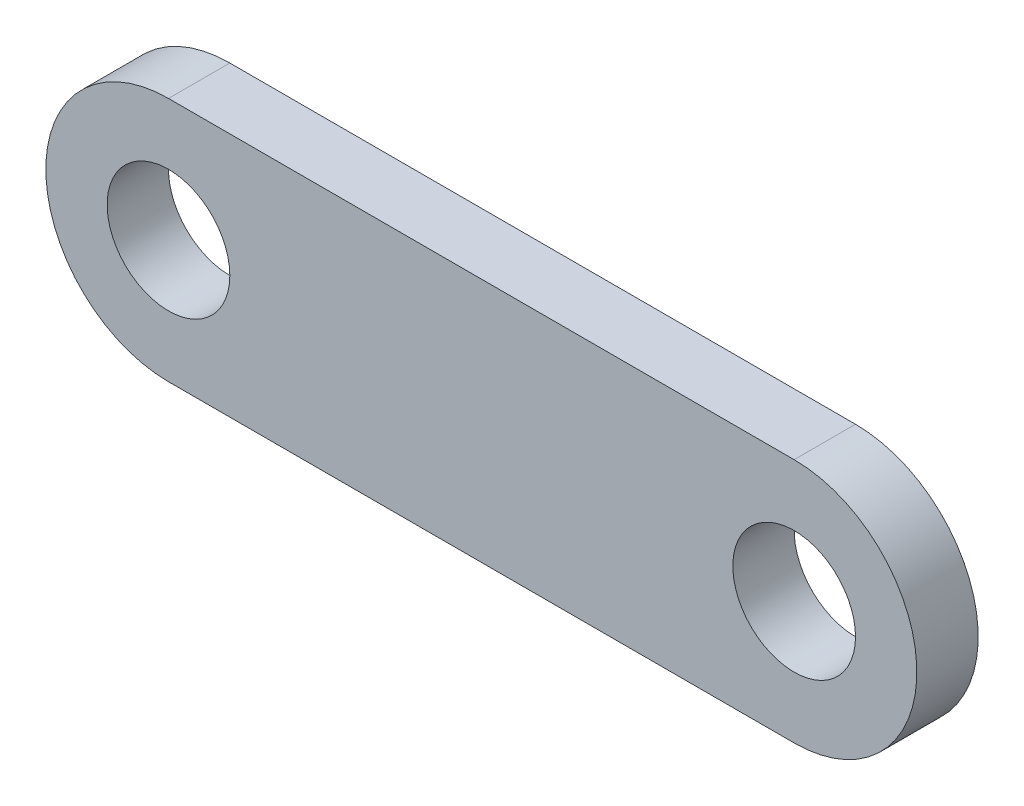
ISO-10303-21;
HEADER;
FILE_DESCRIPTION(('STEP AP214'),'2;1');
FILE_NAME('part.step','',(''),(''),'','','');
FILE_SCHEMA(('AUTOMOTIVE_DESIGN { 1 0 10303 214 1 1 1 1 }'));
ENDSEC;
DATA;
#1=APPLICATION_CONTEXT('core data for automotive mechanical design processes');
#2=APPLICATION_PROTOCOL_DEFINITION('international standard','automotive_design',2000,#1);
#3=PRODUCT_CONTEXT('',#1,'mechanical');
#4=PRODUCT('Part','Part','',(#3));
#5=PRODUCT_RELATED_PRODUCT_CATEGORY('part','',(#4));
#6=PRODUCT_DEFINITION_FORMATION('','',#4);
#7=PRODUCT_DEFINITION_CONTEXT('part definition',#1,'design');
#8=PRODUCT_DEFINITION('design','',#6,#7);
#9=PRODUCT_DEFINITION_SHAPE('','',#8);
#10=(LENGTH_UNIT() NAMED_UNIT(*) SI_UNIT(.MILLI.,.METRE.));
#11=(NAMED_UNIT(*) PLANE_ANGLE_UNIT() SI_UNIT($,.RADIAN.));
#12=(NAMED_UNIT(*) SI_UNIT($,.STERADIAN.) SOLID_ANGLE_UNIT());
#13=UNCERTAINTY_MEASURE_WITH_UNIT(LENGTH_MEASURE(1.E-05),#10,'distance_accuracy_value','');
#14=(GEOMETRIC_REPRESENTATION_CONTEXT(3) GLOBAL_UNCERTAINTY_ASSIGNED_CONTEXT((#13)) GLOBAL_UNIT_ASSIGNED_CONTEXT((#10,
#11,#12)) REPRESENTATION_CONTEXT('',''));
#15=CARTESIAN_POINT('',(0.,0.,0.));
#16=DIRECTION('',(0.,0.,1.));
#17=DIRECTION('',(1.,0.,0.));
#18=AXIS2_PLACEMENT_3D('',#15,#16,#17);
#19=CARTESIAN_POINT('',(-25.5,0.,5.));
#20=DIRECTION('',(0.,0.,1.));
#21=DIRECTION('',(1.,0.,0.));
#22=AXIS2_PLACEMENT_3D('',#19,#20,#21);
#23=PLANE('',#22);
#24=CARTESIAN_POINT('',(25.5,0.,5.));
#25=DIRECTION('',(0.,0.,1.));
#26=DIRECTION('',(1.,0.,0.));
#27=AXIS2_PLACEMENT_3D('',#24,#25,#26);
#28=CIRCLE('',#27,5.);
#29=CARTESIAN_POINT('',(30.5,0.,5.));
#30=VERTEX_POINT('',#29);
#31=EDGE_CURVE('E109',#30,#30,#28,.T.);
#32=ORIENTED_EDGE('',*,*,#31,.F.);
#33=EDGE_LOOP('',(#32));
#34=FACE_BOUND('',#33,.T.);
#35=CARTESIAN_POINT('',(-25.5,0.,5.));
#36=DIRECTION('',(0.,0.,1.));
#37=DIRECTION('',(1.,0.,0.));
#38=AXIS2_PLACEMENT_3D('',#35,#36,#37);
#39=CIRCLE('',#38,10.);
#40=CARTESIAN_POINT('',(-25.5,10.,5.));
#41=VERTEX_POINT('',#40);
#42=CARTESIAN_POINT('',(-25.5,-10.,5.));
#43=VERTEX_POINT('',#42);
#44=EDGE_CURVE('E92',#41,#43,#39,.T.);
#45=ORIENTED_EDGE('',*,*,#44,.T.);
#46=DIRECTION('',(1.,0.,0.));
#47=VECTOR('',#46,1.);
#48=CARTESIAN_POINT('',(-25.5,-10.,5.));
#49=LINE('',#48,#47);
#50=CARTESIAN_POINT('',(25.5,-9.99999999999999,5.));
#51=VERTEX_POINT('',#50);
#52=EDGE_CURVE('E89',#43,#51,#49,.T.);
#53=ORIENTED_EDGE('',*,*,#52,.T.);
#54=CARTESIAN_POINT('',(25.5,0.,5.));
#55=DIRECTION('',(0.,0.,1.));
#56=DIRECTION('',(1.,0.,0.));
#57=AXIS2_PLACEMENT_3D('',#54,#55,#56);
#58=CIRCLE('',#57,10.);
#59=CARTESIAN_POINT('',(25.5,10.,5.));
#60=VERTEX_POINT('',#59);
#61=EDGE_CURVE('E91',#51,#60,#58,.T.);
#62=ORIENTED_EDGE('',*,*,#61,.T.);
#63=DIRECTION('',(-1.,0.,0.));
#64=VECTOR('',#63,1.);
#65=CARTESIAN_POINT('',(-25.5,10.,5.));
#66=LINE('',#65,#64);
#67=EDGE_CURVE('E58',#60,#41,#66,.T.);
#68=ORIENTED_EDGE('',*,*,#67,.T.);
#69=EDGE_LOOP('',(#45,#53,#62,#68));
#70=FACE_BOUND('',#69,.T.);
#71=CARTESIAN_POINT('',(-25.5,0.,5.));
#72=DIRECTION('',(0.,0.,1.));
#73=DIRECTION('',(1.,0.,0.));
#74=AXIS2_PLACEMENT_3D('',#71,#72,#73);
#75=CIRCLE('',#74,5.);
#76=CARTESIAN_POINT('',(-20.5,0.,5.));
#77=VERTEX_POINT('',#76);
#78=EDGE_CURVE('E125',#77,#77,#75,.T.);
#79=ORIENTED_EDGE('',*,*,#78,.F.);
#80=EDGE_LOOP('',(#79));
#81=FACE_BOUND('',#80,.T.);
#82=ADVANCED_FACE('F43',(#34,#70,#81),#23,.T.);
#83=CARTESIAN_POINT('',(-25.5,0.,0.));
#84=DIRECTION('',(0.,0.,1.));
#85=DIRECTION('',(1.,0.,0.));
#86=AXIS2_PLACEMENT_3D('',#83,#84,#85);
#87=PLANE('',#86);
#88=CARTESIAN_POINT('',(-25.5,0.,0.));
#89=DIRECTION('',(0.,0.,1.));
#90=DIRECTION('',(1.,0.,0.));
#91=AXIS2_PLACEMENT_3D('',#88,#89,#90);
#92=CIRCLE('',#91,10.);
#93=CARTESIAN_POINT('',(-25.5,10.,0.));
#94=VERTEX_POINT('',#93);
#95=CARTESIAN_POINT('',(-25.5,-10.,0.));
#96=VERTEX_POINT('',#95);
#97=EDGE_CURVE('E110',#94,#96,#92,.T.);
#98=ORIENTED_EDGE('',*,*,#97,.F.);
#99=DIRECTION('',(-1.,0.,0.));
#100=VECTOR('',#99,1.);
#101=CARTESIAN_POINT('',(-25.5,10.,0.));
#102=LINE('',#101,#100);
#103=CARTESIAN_POINT('',(25.5,10.,0.));
#104=VERTEX_POINT('',#103);
#105=EDGE_CURVE('E84',#104,#94,#102,.T.);
#106=ORIENTED_EDGE('',*,*,#105,.F.);
#107=CARTESIAN_POINT('',(25.5,0.,0.));
#108=DIRECTION('',(0.,0.,1.));
#109=DIRECTION('',(1.,0.,0.));
#110=AXIS2_PLACEMENT_3D('',#107,#108,#109);
#111=CIRCLE('',#110,10.);
#112=CARTESIAN_POINT('',(25.5,-9.99999999999999,0.));
#113=VERTEX_POINT('',#112);
#114=EDGE_CURVE('E80',#113,#104,#111,.T.);
#115=ORIENTED_EDGE('',*,*,#114,.F.);
#116=DIRECTION('',(1.,0.,0.));
#117=VECTOR('',#116,1.);
#118=CARTESIAN_POINT('',(-25.5,-10.,0.));
#119=LINE('',#118,#117);
#120=EDGE_CURVE('E97',#96,#113,#119,.T.);
#121=ORIENTED_EDGE('',*,*,#120,.F.);
#122=EDGE_LOOP('',(#98,#106,#115,#121));
#123=FACE_BOUND('',#122,.T.);
#124=CARTESIAN_POINT('',(25.5,0.,0.));
#125=DIRECTION('',(0.,0.,1.));
#126=DIRECTION('',(1.,0.,0.));
#127=AXIS2_PLACEMENT_3D('',#124,#125,#126);
#128=CIRCLE('',#127,5.);
#129=CARTESIAN_POINT('',(30.5,0.,0.));
#130=VERTEX_POINT('',#129);
#131=EDGE_CURVE('E122',#130,#130,#128,.T.);
#132=ORIENTED_EDGE('',*,*,#131,.T.);
#133=EDGE_LOOP('',(#132));
#134=FACE_BOUND('',#133,.T.);
#135=CARTESIAN_POINT('',(-25.5,0.,0.));
#136=DIRECTION('',(0.,0.,1.));
#137=DIRECTION('',(1.,0.,0.));
#138=AXIS2_PLACEMENT_3D('',#135,#136,#137);
#139=CIRCLE('',#138,5.);
#140=CARTESIAN_POINT('',(-20.5,0.,0.));
#141=VERTEX_POINT('',#140);
#142=EDGE_CURVE('E126',#141,#141,#139,.T.);
#143=ORIENTED_EDGE('',*,*,#142,.T.);
#144=EDGE_LOOP('',(#143));
#145=FACE_BOUND('',#144,.T.);
#146=ADVANCED_FACE('F119',(#123,#134,#145),#87,.F.);
#147=CARTESIAN_POINT('',(-25.5,0.,5.));
#148=DIRECTION('',(0.,0.,-1.));
#149=DIRECTION('',(-1.,0.,0.));
#150=AXIS2_PLACEMENT_3D('',#147,#148,#149);
#151=CYLINDRICAL_SURFACE('',#150,10.);
#152=ORIENTED_EDGE('',*,*,#97,.T.);
#153=DIRECTION('',(0.,0.,-1.));
#154=VECTOR('',#153,1.);
#155=CARTESIAN_POINT('',(-25.5,-10.,5.));
#156=LINE('',#155,#154);
#157=EDGE_CURVE('E11',#43,#96,#156,.T.);
#158=ORIENTED_EDGE('',*,*,#157,.F.);
#159=ORIENTED_EDGE('',*,*,#44,.F.);
#160=DIRECTION('',(0.,0.,-1.));
#161=VECTOR('',#160,1.);
#162=CARTESIAN_POINT('',(-25.5,10.,5.));
#163=LINE('',#162,#161);
#164=EDGE_CURVE('E103',#41,#94,#163,.T.);
#165=ORIENTED_EDGE('',*,*,#164,.T.);
#166=EDGE_LOOP('',(#152,#158,#159,#165));
#167=FACE_BOUND('',#166,.T.);
#168=ADVANCED_FACE('F44',(#167),#151,.T.);
#169=CARTESIAN_POINT('',(-25.5,-10.,5.));
#170=DIRECTION('',(0.,1.,0.));
#171=DIRECTION('',(-1.,0.,0.));
#172=AXIS2_PLACEMENT_3D('',#169,#170,#171);
#173=PLANE('',#172);
#174=ORIENTED_EDGE('',*,*,#120,.T.);
#175=DIRECTION('',(0.,0.,-1.));
#176=VECTOR('',#175,1.);
#177=CARTESIAN_POINT('',(25.5,-9.99999999999999,5.));
#178=LINE('',#177,#176);
#179=EDGE_CURVE('E55',#51,#113,#178,.T.);
#180=ORIENTED_EDGE('',*,*,#179,.F.);
#181=ORIENTED_EDGE('',*,*,#52,.F.);
#182=ORIENTED_EDGE('',*,*,#157,.T.);
#183=EDGE_LOOP('',(#174,#180,#181,#182));
#184=FACE_BOUND('',#183,.T.);
#185=ADVANCED_FACE('F98',(#184),#173,.F.);
#186=CARTESIAN_POINT('',(25.5,0.,5.));
#187=DIRECTION('',(0.,0.,-1.));
#188=DIRECTION('',(-1.,0.,0.));
#189=AXIS2_PLACEMENT_3D('',#186,#187,#188);
#190=CYLINDRICAL_SURFACE('',#189,10.);
#191=ORIENTED_EDGE('',*,*,#114,.T.);
#192=DIRECTION('',(0.,0.,-1.));
#193=VECTOR('',#192,1.);
#194=CARTESIAN_POINT('',(25.5,10.,5.));
#195=LINE('',#194,#193);
#196=EDGE_CURVE('E99',#60,#104,#195,.T.);
#197=ORIENTED_EDGE('',*,*,#196,.F.);
#198=ORIENTED_EDGE('',*,*,#61,.F.);
#199=ORIENTED_EDGE('',*,*,#179,.T.);
#200=EDGE_LOOP('',(#191,#197,#198,#199));
#201=FACE_BOUND('',#200,.T.);
#202=ADVANCED_FACE('F101',(#201),#190,.T.);
#203=CARTESIAN_POINT('',(-25.5,10.,5.));
#204=DIRECTION('',(0.,-1.,0.));
#205=DIRECTION('',(1.,0.,0.));
#206=AXIS2_PLACEMENT_3D('',#203,#204,#205);
#207=PLANE('',#206);
#208=ORIENTED_EDGE('',*,*,#105,.T.);
#209=ORIENTED_EDGE('',*,*,#164,.F.);
#210=ORIENTED_EDGE('',*,*,#67,.F.);
#211=ORIENTED_EDGE('',*,*,#196,.T.);
#212=EDGE_LOOP('',(#208,#209,#210,#211));
#213=FACE_BOUND('',#212,.T.);
#214=ADVANCED_FACE('F113',(#213),#207,.F.);
#215=CARTESIAN_POINT('',(25.5,0.,5.));
#216=DIRECTION('',(0.,0.,-1.));
#217=DIRECTION('',(-1.,0.,0.));
#218=AXIS2_PLACEMENT_3D('',#215,#216,#217);
#219=CYLINDRICAL_SURFACE('',#218,5.);
#220=ORIENTED_EDGE('',*,*,#31,.T.);
#221=EDGE_LOOP('',(#220));
#222=FACE_BOUND('',#221,.T.);
#223=ORIENTED_EDGE('',*,*,#131,.F.);
#224=EDGE_LOOP('',(#223));
#225=FACE_BOUND('',#224,.T.);
#226=ADVANCED_FACE('F144',(#222,#225),#219,.F.);
#227=CARTESIAN_POINT('',(-25.5,0.,5.));
#228=DIRECTION('',(0.,0.,-1.));
#229=DIRECTION('',(-1.,0.,0.));
#230=AXIS2_PLACEMENT_3D('',#227,#228,#229);
#231=CYLINDRICAL_SURFACE('',#230,5.);
#232=ORIENTED_EDGE('',*,*,#78,.T.);
#233=EDGE_LOOP('',(#232));
#234=FACE_BOUND('',#233,.T.);
#235=ORIENTED_EDGE('',*,*,#142,.F.);
#236=EDGE_LOOP('',(#235));
#237=FACE_BOUND('',#236,.T.);
#238=ADVANCED_FACE('F131',(#234,#237),#231,.F.);
#239=CLOSED_SHELL('',(#82,#146,#168,#185,#202,#214,#226,#238));
#240=MANIFOLD_SOLID_BREP('B2',#239);
#241=ADVANCED_BREP_SHAPE_REPRESENTATION('',(#18,#240),#14);
#242=SHAPE_DEFINITION_REPRESENTATION(#9,#241);
ENDSEC;
END-ISO-10303-21;
